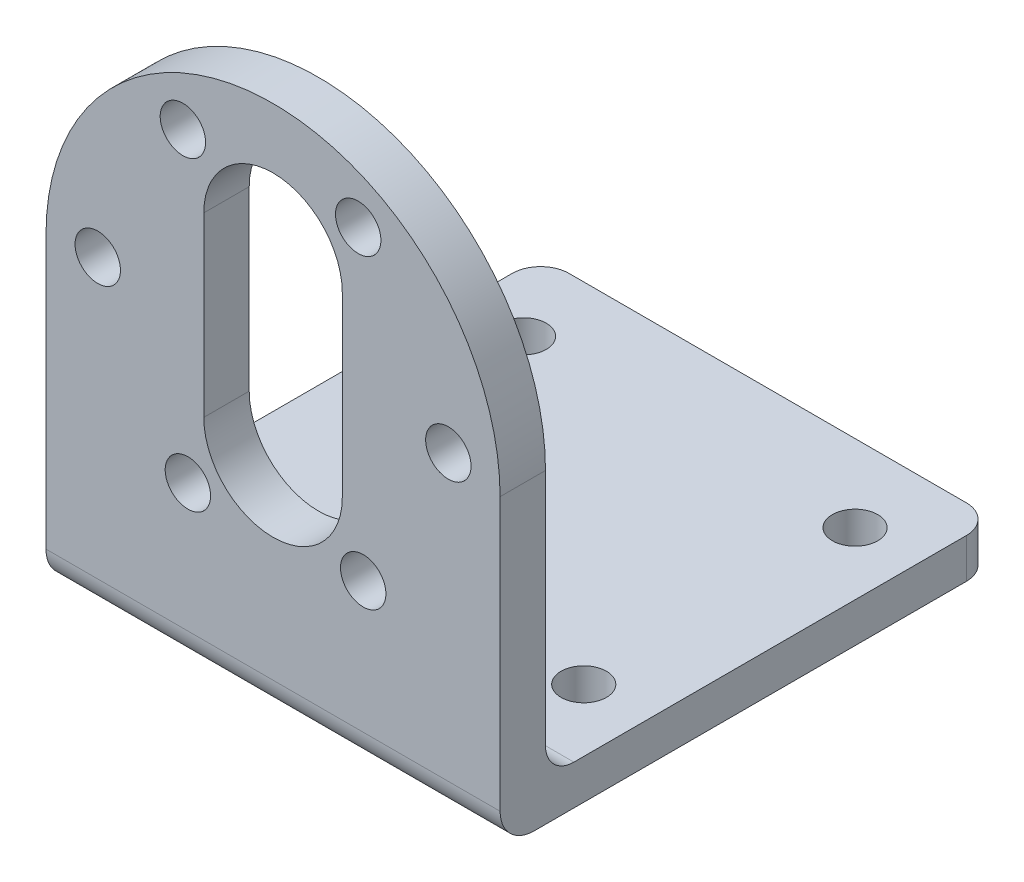
ISO-10303-21;
HEADER;
FILE_DESCRIPTION(('STEP AP214'),'2;1');
FILE_NAME('part.step','',(''),(''),'','','');
FILE_SCHEMA(('AUTOMOTIVE_DESIGN { 1 0 10303 214 1 1 1 1 }'));
ENDSEC;
DATA;
#1=APPLICATION_CONTEXT('core data for automotive mechanical design processes');
#2=APPLICATION_PROTOCOL_DEFINITION('international standard','automotive_design',2000,#1);
#3=PRODUCT_CONTEXT('',#1,'mechanical');
#4=PRODUCT('Part','Part','',(#3));
#5=PRODUCT_RELATED_PRODUCT_CATEGORY('part','',(#4));
#6=PRODUCT_DEFINITION_FORMATION('','',#4);
#7=PRODUCT_DEFINITION_CONTEXT('part definition',#1,'design');
#8=PRODUCT_DEFINITION('design','',#6,#7);
#9=PRODUCT_DEFINITION_SHAPE('','',#8);
#10=(LENGTH_UNIT() NAMED_UNIT(*) SI_UNIT(.MILLI.,.METRE.));
#11=(NAMED_UNIT(*) PLANE_ANGLE_UNIT() SI_UNIT($,.RADIAN.));
#12=(NAMED_UNIT(*) SI_UNIT($,.STERADIAN.) SOLID_ANGLE_UNIT());
#13=UNCERTAINTY_MEASURE_WITH_UNIT(LENGTH_MEASURE(1.E-05),#10,'distance_accuracy_value','');
#14=(GEOMETRIC_REPRESENTATION_CONTEXT(3) GLOBAL_UNCERTAINTY_ASSIGNED_CONTEXT((#13)) GLOBAL_UNIT_ASSIGNED_CONTEXT((#10,
#11,#12)) REPRESENTATION_CONTEXT('',''));
#15=CARTESIAN_POINT('',(0.,0.,0.));
#16=DIRECTION('',(0.,0.,1.));
#17=DIRECTION('',(1.,0.,0.));
#18=AXIS2_PLACEMENT_3D('',#15,#16,#17);
#19=CARTESIAN_POINT('',(40.,36.5355172413793,35.3894084655198));
#20=DIRECTION('',(0.,0.,-1.));
#21=DIRECTION('',(0.,1.,0.));
#22=AXIS2_PLACEMENT_3D('',#19,#20,#21);
#23=PLANE('',#22);
#24=CARTESIAN_POINT('',(4.5586570489113,23.0107077697608,35.3894084655198));
#25=DIRECTION('',(0.,0.,-1.));
#26=DIRECTION('',(0.,1.,0.));
#27=AXIS2_PLACEMENT_3D('',#24,#25,#26);
#28=CIRCLE('',#27,2.00000000000148);
#29=CARTESIAN_POINT('',(4.5586570489113,25.0107077697623,35.3894084655198));
#30=VERTEX_POINT('',#29);
#31=EDGE_CURVE('E726',#30,#30,#28,.F.);
#32=ORIENTED_EDGE('',*,*,#31,.T.);
#33=EDGE_LOOP('',(#32));
#34=FACE_BOUND('',#33,.T.);
#35=CARTESIAN_POINT('',(12.0586570489103,36.5107077697614,35.3894084655198));
#36=DIRECTION('',(0.,0.,-1.));
#37=DIRECTION('',(0.,1.,0.));
#38=AXIS2_PLACEMENT_3D('',#35,#36,#37);
#39=CIRCLE('',#38,2.00000000000082);
#40=CARTESIAN_POINT('',(12.0586570489103,38.5107077697622,35.3894084655198));
#41=VERTEX_POINT('',#40);
#42=EDGE_CURVE('E730',#41,#41,#39,.F.);
#43=ORIENTED_EDGE('',*,*,#42,.T.);
#44=EDGE_LOOP('',(#43));
#45=FACE_BOUND('',#44,.T.);
#46=CARTESIAN_POINT('',(27.5,36.7655172413793,35.3894084655198));
#47=DIRECTION('',(0.,0.,-1.));
#48=DIRECTION('',(0.,1.,0.));
#49=AXIS2_PLACEMENT_3D('',#46,#47,#48);
#50=CIRCLE('',#49,2.);
#51=CARTESIAN_POINT('',(27.5,38.7655172413793,35.3894084655198));
#52=VERTEX_POINT('',#51);
#53=EDGE_CURVE('E760',#52,#52,#50,.F.);
#54=ORIENTED_EDGE('',*,*,#53,.T.);
#55=EDGE_LOOP('',(#54));
#56=FACE_BOUND('',#55,.T.);
#57=CARTESIAN_POINT('',(35.4413429510911,23.5203267129966,35.3894084655198));
#58=DIRECTION('',(0.,0.,-1.));
#59=DIRECTION('',(0.,1.,0.));
#60=AXIS2_PLACEMENT_3D('',#57,#58,#59);
#61=CIRCLE('',#60,1.99999999999968);
#62=CARTESIAN_POINT('',(35.4413429510911,25.5203267129963,35.3894084655198));
#63=VERTEX_POINT('',#62);
#64=EDGE_CURVE('E754',#63,#63,#61,.F.);
#65=ORIENTED_EDGE('',*,*,#64,.T.);
#66=EDGE_LOOP('',(#65));
#67=FACE_BOUND('',#66,.T.);
#68=CARTESIAN_POINT('',(27.9413429510923,10.020326712996,35.3894084655198));
#69=DIRECTION('',(0.,0.,-1.));
#70=DIRECTION('',(0.,1.,0.));
#71=AXIS2_PLACEMENT_3D('',#68,#69,#70);
#72=CIRCLE('',#71,2.00000000000045);
#73=CARTESIAN_POINT('',(27.9413429510923,12.0203267129965,35.3894084655198));
#74=VERTEX_POINT('',#73);
#75=EDGE_CURVE('E739',#74,#74,#72,.F.);
#76=ORIENTED_EDGE('',*,*,#75,.T.);
#77=EDGE_LOOP('',(#76));
#78=FACE_BOUND('',#77,.T.);
#79=CARTESIAN_POINT('',(12.5000000000024,9.76551724137795,35.3894084655198));
#80=DIRECTION('',(0.,0.,-1.));
#81=DIRECTION('',(0.,1.,0.));
#82=AXIS2_PLACEMENT_3D('',#79,#80,#81);
#83=CIRCLE('',#82,2.00000000000139);
#84=CARTESIAN_POINT('',(12.5000000000024,11.7655172413793,35.3894084655198));
#85=VERTEX_POINT('',#84);
#86=EDGE_CURVE('E738',#85,#85,#83,.F.);
#87=ORIENTED_EDGE('',*,*,#86,.T.);
#88=EDGE_LOOP('',(#87));
#89=FACE_BOUND('',#88,.T.);
#90=DIRECTION('',(0.,1.,0.));
#91=VECTOR('',#90,1.);
#92=CARTESIAN_POINT('',(26.1,31.0655172413793,35.3894084655198));
#93=LINE('',#92,#91);
#94=CARTESIAN_POINT('',(26.1,15.4655172413793,35.3894084655198));
#95=VERTEX_POINT('',#94);
#96=CARTESIAN_POINT('',(26.1,31.0655172413793,35.3894084655198));
#97=VERTEX_POINT('',#96);
#98=EDGE_CURVE('E261',#95,#97,#93,.T.);
#99=ORIENTED_EDGE('',*,*,#98,.T.);
#100=CARTESIAN_POINT('',(20.,31.0655172413793,35.3894084655198));
#101=DIRECTION('',(0.,0.,-1.));
#102=DIRECTION('',(0.,1.,0.));
#103=AXIS2_PLACEMENT_3D('',#100,#101,#102);
#104=CIRCLE('',#103,6.1);
#105=CARTESIAN_POINT('',(13.9,31.0655172413793,35.3894084655198));
#106=VERTEX_POINT('',#105);
#107=EDGE_CURVE('E248',#97,#106,#104,.F.);
#108=ORIENTED_EDGE('',*,*,#107,.T.);
#109=DIRECTION('',(0.,-1.,0.));
#110=VECTOR('',#109,1.);
#111=CARTESIAN_POINT('',(13.9,15.4655172413793,35.3894084655198));
#112=LINE('',#111,#110);
#113=CARTESIAN_POINT('',(13.9,15.4655172413793,35.3894084655198));
#114=VERTEX_POINT('',#113);
#115=EDGE_CURVE('E278',#106,#114,#112,.T.);
#116=ORIENTED_EDGE('',*,*,#115,.T.);
#117=CARTESIAN_POINT('',(20.,15.4655172413793,35.3894084655198));
#118=DIRECTION('',(0.,0.,-1.));
#119=DIRECTION('',(0.,1.,0.));
#120=AXIS2_PLACEMENT_3D('',#117,#118,#119);
#121=CIRCLE('',#120,6.1);
#122=EDGE_CURVE('E268',#114,#95,#121,.F.);
#123=ORIENTED_EDGE('',*,*,#122,.T.);
#124=EDGE_LOOP('',(#99,#108,#116,#123));
#125=FACE_BOUND('',#124,.T.);
#126=DIRECTION('',(0.,-1.,0.));
#127=VECTOR('',#126,1.);
#128=CARTESIAN_POINT('',(0.,36.5355172413793,35.3894084655198));
#129=LINE('',#128,#127);
#130=CARTESIAN_POINT('',(0.,22.4655172413793,35.3894084655198));
#131=VERTEX_POINT('',#130);
#132=CARTESIAN_POINT('',(0.,1.46551724137931,35.3894084655198));
#133=VERTEX_POINT('',#132);
#134=EDGE_CURVE('E337',#131,#133,#129,.T.);
#135=ORIENTED_EDGE('',*,*,#134,.F.);
#136=CARTESIAN_POINT('',(20.,22.4655172413793,35.3894084655198));
#137=DIRECTION('',(0.,0.,-1.));
#138=DIRECTION('',(0.,1.,0.));
#139=AXIS2_PLACEMENT_3D('',#136,#137,#138);
#140=CIRCLE('',#139,20.);
#141=CARTESIAN_POINT('',(40.,22.4655172413793,35.3894084655198));
#142=VERTEX_POINT('',#141);
#143=EDGE_CURVE('E286',#142,#131,#140,.F.);
#144=ORIENTED_EDGE('',*,*,#143,.F.);
#145=DIRECTION('',(0.,-1.,0.));
#146=VECTOR('',#145,1.);
#147=CARTESIAN_POINT('',(40.,36.5355172413793,35.3894084655198));
#148=LINE('',#147,#146);
#149=CARTESIAN_POINT('',(40.,1.46551724137931,35.3894084655198));
#150=VERTEX_POINT('',#149);
#151=EDGE_CURVE('E333',#142,#150,#148,.T.);
#152=ORIENTED_EDGE('',*,*,#151,.T.);
#153=DIRECTION('',(1.,0.,0.));
#154=VECTOR('',#153,1.);
#155=CARTESIAN_POINT('',(0.,1.46551724137931,35.3894084655198));
#156=LINE('',#155,#154);
#157=EDGE_CURVE('E350',#150,#133,#156,.F.);
#158=ORIENTED_EDGE('',*,*,#157,.T.);
#159=EDGE_LOOP('',(#135,#144,#152,#158));
#160=FACE_BOUND('',#159,.T.);
#161=ADVANCED_FACE('F147',(#34,#45,#56,#67,#78,#89,#125,#160),#23,.T.);
#162=CARTESIAN_POINT('',(0.,0.,0.));
#163=DIRECTION('',(1.,0.,0.));
#164=DIRECTION('',(0.,0.,-1.));
#165=AXIS2_PLACEMENT_3D('',#162,#163,#164);
#166=PLANE('',#165);
#167=DIRECTION('',(0.,0.,-1.));
#168=VECTOR('',#167,1.);
#169=CARTESIAN_POINT('',(0.,-4.53448275862069,39.3894084655199));
#170=LINE('',#169,#168);
#171=CARTESIAN_POINT('',(0.,-4.53448275862069,36.3894084655199));
#172=VERTEX_POINT('',#171);
#173=CARTESIAN_POINT('',(0.,-4.53448275862069,-1.67959153448014));
#174=VERTEX_POINT('',#173);
#175=EDGE_CURVE('E321',#172,#174,#170,.T.);
#176=ORIENTED_EDGE('',*,*,#175,.F.);
#177=CARTESIAN_POINT('',(0.,-1.53448275862069,36.3894084655199));
#178=DIRECTION('',(1.,0.,0.));
#179=DIRECTION('',(0.,0.,-1.));
#180=AXIS2_PLACEMENT_3D('',#177,#178,#179);
#181=CIRCLE('',#180,3.);
#182=CARTESIAN_POINT('',(0.,-1.53448275862069,39.3894084655199));
#183=VERTEX_POINT('',#182);
#184=EDGE_CURVE('E378',#172,#183,#181,.F.);
#185=ORIENTED_EDGE('',*,*,#184,.T.);
#186=DIRECTION('',(0.,-1.,0.));
#187=VECTOR('',#186,1.);
#188=CARTESIAN_POINT('',(0.,16.5355172413793,39.3894084655199));
#189=LINE('',#188,#187);
#190=CARTESIAN_POINT('',(0.,22.4655172413793,39.3894084655199));
#191=VERTEX_POINT('',#190);
#192=EDGE_CURVE('E326',#191,#183,#189,.T.);
#193=ORIENTED_EDGE('',*,*,#192,.F.);
#194=DIRECTION('',(0.,0.,-1.));
#195=VECTOR('',#194,1.);
#196=CARTESIAN_POINT('',(0.,22.4655172413793,39.3894084655199));
#197=LINE('',#196,#195);
#198=EDGE_CURVE('E288',#191,#131,#197,.T.);
#199=ORIENTED_EDGE('',*,*,#198,.T.);
#200=ORIENTED_EDGE('',*,*,#134,.T.);
#201=CARTESIAN_POINT('',(0.,1.46551724137931,32.8894084655198));
#202=DIRECTION('',(1.,0.,0.));
#203=DIRECTION('',(0.,0.,-1.));
#204=AXIS2_PLACEMENT_3D('',#201,#202,#203);
#205=CIRCLE('',#204,2.5);
#206=CARTESIAN_POINT('',(0.,-1.03448275862069,32.8894084655198));
#207=VERTEX_POINT('',#206);
#208=EDGE_CURVE('E354',#133,#207,#205,.T.);
#209=ORIENTED_EDGE('',*,*,#208,.T.);
#210=DIRECTION('',(0.,0.,-1.));
#211=VECTOR('',#210,1.);
#212=CARTESIAN_POINT('',(0.,-1.03448275862069,36.8894084655199));
#213=LINE('',#212,#211);
#214=CARTESIAN_POINT('',(0.,-1.03448275862069,-1.67959153448014));
#215=VERTEX_POINT('',#214);
#216=EDGE_CURVE('E332',#207,#215,#213,.T.);
#217=ORIENTED_EDGE('',*,*,#216,.T.);
#218=DIRECTION('',(0.,1.,0.));
#219=VECTOR('',#218,1.);
#220=CARTESIAN_POINT('',(0.,0.,-1.67959153448014));
#221=LINE('',#220,#219);
#222=EDGE_CURVE('E372',#215,#174,#221,.F.);
#223=ORIENTED_EDGE('',*,*,#222,.T.);
#224=EDGE_LOOP('',(#176,#185,#193,#199,#200,#209,#217,#223));
#225=FACE_BOUND('',#224,.T.);
#226=ADVANCED_FACE('F396',(#225),#166,.F.);
#227=CARTESIAN_POINT('',(40.,0.,0.));
#228=DIRECTION('',(1.,0.,0.));
#229=DIRECTION('',(0.,0.,-1.));
#230=AXIS2_PLACEMENT_3D('',#227,#228,#229);
#231=PLANE('',#230);
#232=DIRECTION('',(0.,1.,0.));
#233=VECTOR('',#232,1.);
#234=CARTESIAN_POINT('',(40.,-2.53448275862069,39.3894084655199));
#235=LINE('',#234,#233);
#236=CARTESIAN_POINT('',(40.,-1.53448275862069,39.3894084655199));
#237=VERTEX_POINT('',#236);
#238=CARTESIAN_POINT('',(40.,22.4655172413793,39.3894084655199));
#239=VERTEX_POINT('',#238);
#240=EDGE_CURVE('E329',#237,#239,#235,.T.);
#241=ORIENTED_EDGE('',*,*,#240,.F.);
#242=CARTESIAN_POINT('',(40.,-1.53448275862069,36.3894084655199));
#243=DIRECTION('',(1.,0.,0.));
#244=DIRECTION('',(0.,0.,-1.));
#245=AXIS2_PLACEMENT_3D('',#242,#243,#244);
#246=CIRCLE('',#245,3.);
#247=CARTESIAN_POINT('',(40.,-4.53448275862069,36.3894084655199));
#248=VERTEX_POINT('',#247);
#249=EDGE_CURVE('E12',#237,#248,#246,.T.);
#250=ORIENTED_EDGE('',*,*,#249,.T.);
#251=DIRECTION('',(0.,0.,1.));
#252=VECTOR('',#251,1.);
#253=CARTESIAN_POINT('',(40.,-4.53448275862069,39.3894084655199));
#254=LINE('',#253,#252);
#255=CARTESIAN_POINT('',(40.,-4.53448275862069,-1.67959153448014));
#256=VERTEX_POINT('',#255);
#257=EDGE_CURVE('E318',#256,#248,#254,.T.);
#258=ORIENTED_EDGE('',*,*,#257,.F.);
#259=DIRECTION('',(0.,1.,0.));
#260=VECTOR('',#259,1.);
#261=CARTESIAN_POINT('',(40.,-1.03448275862069,-1.67959153448014));
#262=LINE('',#261,#260);
#263=CARTESIAN_POINT('',(40.,-1.03448275862069,-1.67959153448014));
#264=VERTEX_POINT('',#263);
#265=EDGE_CURVE('E356',#256,#264,#262,.T.);
#266=ORIENTED_EDGE('',*,*,#265,.T.);
#267=DIRECTION('',(0.,0.,-1.));
#268=VECTOR('',#267,1.);
#269=CARTESIAN_POINT('',(40.,-1.03448275862069,36.8894084655199));
#270=LINE('',#269,#268);
#271=CARTESIAN_POINT('',(40.,-1.03448275862069,32.8894084655198));
#272=VERTEX_POINT('',#271);
#273=EDGE_CURVE('E341',#272,#264,#270,.T.);
#274=ORIENTED_EDGE('',*,*,#273,.F.);
#275=CARTESIAN_POINT('',(40.,1.46551724137931,32.8894084655198));
#276=DIRECTION('',(1.,0.,0.));
#277=DIRECTION('',(0.,0.,-1.));
#278=AXIS2_PLACEMENT_3D('',#275,#276,#277);
#279=CIRCLE('',#278,2.5);
#280=EDGE_CURVE('E352',#272,#150,#279,.F.);
#281=ORIENTED_EDGE('',*,*,#280,.T.);
#282=ORIENTED_EDGE('',*,*,#151,.F.);
#283=DIRECTION('',(0.,0.,1.));
#284=VECTOR('',#283,1.);
#285=CARTESIAN_POINT('',(40.,22.4655172413793,39.3894084655199));
#286=LINE('',#285,#284);
#287=EDGE_CURVE('E291',#142,#239,#286,.T.);
#288=ORIENTED_EDGE('',*,*,#287,.T.);
#289=EDGE_LOOP('',(#241,#250,#258,#266,#274,#281,#282,#288));
#290=FACE_BOUND('',#289,.T.);
#291=ADVANCED_FACE('F387',(#290),#231,.T.);
#292=CARTESIAN_POINT('',(40.,-2.53448275862069,-4.17959153448014));
#293=DIRECTION('',(0.,0.,1.));
#294=DIRECTION('',(1.,0.,0.));
#295=AXIS2_PLACEMENT_3D('',#292,#293,#294);
#296=PLANE('',#295);
#297=DIRECTION('',(-1.,0.,0.));
#298=VECTOR('',#297,1.);
#299=CARTESIAN_POINT('',(40.,-1.03448275862069,-4.17959153448014));
#300=LINE('',#299,#298);
#301=CARTESIAN_POINT('',(37.5,-1.03448275862069,-4.17959153448014));
#302=VERTEX_POINT('',#301);
#303=CARTESIAN_POINT('',(2.5,-1.03448275862069,-4.17959153448014));
#304=VERTEX_POINT('',#303);
#305=EDGE_CURVE('E340',#302,#304,#300,.T.);
#306=ORIENTED_EDGE('',*,*,#305,.F.);
#307=DIRECTION('',(0.,1.,0.));
#308=VECTOR('',#307,1.);
#309=CARTESIAN_POINT('',(37.5,-4.53448275862069,-4.17959153448014));
#310=LINE('',#309,#308);
#311=CARTESIAN_POINT('',(37.5,-4.53448275862069,-4.17959153448014));
#312=VERTEX_POINT('',#311);
#313=EDGE_CURVE('E366',#302,#312,#310,.F.);
#314=ORIENTED_EDGE('',*,*,#313,.T.);
#315=DIRECTION('',(1.,0.,0.));
#316=VECTOR('',#315,1.);
#317=CARTESIAN_POINT('',(40.,-4.53448275862069,-4.17959153448014));
#318=LINE('',#317,#316);
#319=CARTESIAN_POINT('',(2.5,-4.53448275862069,-4.17959153448014));
#320=VERTEX_POINT('',#319);
#321=EDGE_CURVE('E323',#320,#312,#318,.T.);
#322=ORIENTED_EDGE('',*,*,#321,.F.);
#323=DIRECTION('',(0.,1.,0.));
#324=VECTOR('',#323,1.);
#325=CARTESIAN_POINT('',(2.5,-2.53448275862069,-4.17959153448014));
#326=LINE('',#325,#324);
#327=EDGE_CURVE('E363',#320,#304,#326,.T.);
#328=ORIENTED_EDGE('',*,*,#327,.T.);
#329=EDGE_LOOP('',(#306,#314,#322,#328));
#330=FACE_BOUND('',#329,.T.);
#331=ADVANCED_FACE('F407',(#330),#296,.F.);
#332=CARTESIAN_POINT('',(40.,-1.03448275862069,36.8894084655199));
#333=DIRECTION('',(0.,1.,0.));
#334=DIRECTION('',(0.,0.,1.));
#335=AXIS2_PLACEMENT_3D('',#332,#333,#334);
#336=PLANE('',#335);
#337=CARTESIAN_POINT('',(34.5,-1.03448275862069,26.5204084655199));
#338=DIRECTION('',(0.,1.,0.));
#339=DIRECTION('',(0.,0.,1.));
#340=AXIS2_PLACEMENT_3D('',#337,#338,#339);
#341=CIRCLE('',#340,2.);
#342=CARTESIAN_POINT('',(34.5,-1.03448275862069,28.5204084655199));
#343=VERTEX_POINT('',#342);
#344=EDGE_CURVE('E301',#343,#343,#341,.T.);
#345=ORIENTED_EDGE('',*,*,#344,.F.);
#346=EDGE_LOOP('',(#345));
#347=FACE_BOUND('',#346,.T.);
#348=CARTESIAN_POINT('',(5.3,-1.03448275862069,2.62040846551986));
#349=DIRECTION('',(0.,1.,0.));
#350=DIRECTION('',(0.,0.,1.));
#351=AXIS2_PLACEMENT_3D('',#348,#349,#350);
#352=CIRCLE('',#351,2.);
#353=CARTESIAN_POINT('',(5.3,-1.03448275862069,4.62040846551986));
#354=VERTEX_POINT('',#353);
#355=EDGE_CURVE('E300',#354,#354,#352,.T.);
#356=ORIENTED_EDGE('',*,*,#355,.F.);
#357=EDGE_LOOP('',(#356));
#358=FACE_BOUND('',#357,.T.);
#359=CARTESIAN_POINT('',(5.3,-1.03448275862069,26.5204084655199));
#360=DIRECTION('',(0.,1.,0.));
#361=DIRECTION('',(0.,0.,1.));
#362=AXIS2_PLACEMENT_3D('',#359,#360,#361);
#363=CIRCLE('',#362,2.);
#364=CARTESIAN_POINT('',(5.3,-1.03448275862069,28.5204084655199));
#365=VERTEX_POINT('',#364);
#366=EDGE_CURVE('E294',#365,#365,#363,.T.);
#367=ORIENTED_EDGE('',*,*,#366,.F.);
#368=EDGE_LOOP('',(#367));
#369=FACE_BOUND('',#368,.T.);
#370=CARTESIAN_POINT('',(34.5,-1.03448275862069,2.62040846551986));
#371=DIRECTION('',(0.,1.,0.));
#372=DIRECTION('',(0.,0.,1.));
#373=AXIS2_PLACEMENT_3D('',#370,#371,#372);
#374=CIRCLE('',#373,2.);
#375=CARTESIAN_POINT('',(34.5,-1.03448275862069,4.62040846551986));
#376=VERTEX_POINT('',#375);
#377=EDGE_CURVE('E308',#376,#376,#374,.T.);
#378=ORIENTED_EDGE('',*,*,#377,.F.);
#379=EDGE_LOOP('',(#378));
#380=FACE_BOUND('',#379,.T.);
#381=ORIENTED_EDGE('',*,*,#273,.T.);
#382=CARTESIAN_POINT('',(37.5,-1.03448275862069,-1.67959153448014));
#383=DIRECTION('',(0.,1.,0.));
#384=DIRECTION('',(0.,0.,1.));
#385=AXIS2_PLACEMENT_3D('',#382,#383,#384);
#386=CIRCLE('',#385,2.5);
#387=EDGE_CURVE('E361',#264,#302,#386,.T.);
#388=ORIENTED_EDGE('',*,*,#387,.T.);
#389=ORIENTED_EDGE('',*,*,#305,.T.);
#390=CARTESIAN_POINT('',(2.5,-1.03448275862069,-1.67959153448014));
#391=DIRECTION('',(0.,1.,0.));
#392=DIRECTION('',(0.,0.,1.));
#393=AXIS2_PLACEMENT_3D('',#390,#391,#392);
#394=CIRCLE('',#393,2.5);
#395=EDGE_CURVE('E359',#304,#215,#394,.T.);
#396=ORIENTED_EDGE('',*,*,#395,.T.);
#397=ORIENTED_EDGE('',*,*,#216,.F.);
#398=DIRECTION('',(1.,0.,0.));
#399=VECTOR('',#398,1.);
#400=CARTESIAN_POINT('',(40.,-1.03448275862069,32.8894084655198));
#401=LINE('',#400,#399);
#402=EDGE_CURVE('E336',#207,#272,#401,.T.);
#403=ORIENTED_EDGE('',*,*,#402,.T.);
#404=EDGE_LOOP('',(#381,#388,#389,#396,#397,#403));
#405=FACE_BOUND('',#404,.T.);
#406=ADVANCED_FACE('F414',(#347,#358,#369,#380,#405),#336,.T.);
#407=CARTESIAN_POINT('',(20.,16.5355172413793,39.3894084655199));
#408=DIRECTION('',(0.,0.,1.));
#409=DIRECTION('',(1.,0.,0.));
#410=AXIS2_PLACEMENT_3D('',#407,#408,#409);
#411=PLANE('',#410);
#412=CARTESIAN_POINT('',(4.5586570489113,23.0107077697608,39.3894084655199));
#413=DIRECTION('',(0.,0.,1.));
#414=DIRECTION('',(1.,0.,0.));
#415=AXIS2_PLACEMENT_3D('',#412,#413,#414);
#416=CIRCLE('',#415,2.00000000000148);
#417=CARTESIAN_POINT('',(6.55865704891278,23.0107077697608,39.3894084655199));
#418=VERTEX_POINT('',#417);
#419=EDGE_CURVE('E724',#418,#418,#416,.T.);
#420=ORIENTED_EDGE('',*,*,#419,.F.);
#421=EDGE_LOOP('',(#420));
#422=FACE_BOUND('',#421,.T.);
#423=CARTESIAN_POINT('',(12.0586570489103,36.5107077697614,39.3894084655199));
#424=DIRECTION('',(0.,0.,1.));
#425=DIRECTION('',(1.,0.,0.));
#426=AXIS2_PLACEMENT_3D('',#423,#424,#425);
#427=CIRCLE('',#426,2.00000000000082);
#428=CARTESIAN_POINT('',(14.0586570489111,36.5107077697614,39.3894084655199));
#429=VERTEX_POINT('',#428);
#430=EDGE_CURVE('E727',#429,#429,#427,.T.);
#431=ORIENTED_EDGE('',*,*,#430,.F.);
#432=EDGE_LOOP('',(#431));
#433=FACE_BOUND('',#432,.T.);
#434=CARTESIAN_POINT('',(27.5,36.7655172413793,39.3894084655199));
#435=DIRECTION('',(0.,0.,1.));
#436=DIRECTION('',(1.,0.,0.));
#437=AXIS2_PLACEMENT_3D('',#434,#435,#436);
#438=CIRCLE('',#437,2.);
#439=CARTESIAN_POINT('',(29.5,36.7655172413793,39.3894084655199));
#440=VERTEX_POINT('',#439);
#441=EDGE_CURVE('E763',#440,#440,#438,.T.);
#442=ORIENTED_EDGE('',*,*,#441,.F.);
#443=EDGE_LOOP('',(#442));
#444=FACE_BOUND('',#443,.T.);
#445=CARTESIAN_POINT('',(35.4413429510911,23.5203267129966,39.3894084655199));
#446=DIRECTION('',(0.,0.,1.));
#447=DIRECTION('',(1.,0.,0.));
#448=AXIS2_PLACEMENT_3D('',#445,#446,#447);
#449=CIRCLE('',#448,1.99999999999968);
#450=CARTESIAN_POINT('',(37.4413429510908,23.5203267129966,39.3894084655199));
#451=VERTEX_POINT('',#450);
#452=EDGE_CURVE('E757',#451,#451,#449,.T.);
#453=ORIENTED_EDGE('',*,*,#452,.F.);
#454=EDGE_LOOP('',(#453));
#455=FACE_BOUND('',#454,.T.);
#456=CARTESIAN_POINT('',(27.9413429510923,10.020326712996,39.3894084655199));
#457=DIRECTION('',(0.,0.,1.));
#458=DIRECTION('',(1.,0.,0.));
#459=AXIS2_PLACEMENT_3D('',#456,#457,#458);
#460=CIRCLE('',#459,2.00000000000045);
#461=CARTESIAN_POINT('',(29.9413429510928,10.020326712996,39.3894084655199));
#462=VERTEX_POINT('',#461);
#463=EDGE_CURVE('E749',#462,#462,#460,.T.);
#464=ORIENTED_EDGE('',*,*,#463,.F.);
#465=EDGE_LOOP('',(#464));
#466=FACE_BOUND('',#465,.T.);
#467=CARTESIAN_POINT('',(12.5000000000024,9.76551724137795,39.3894084655199));
#468=DIRECTION('',(0.,0.,1.));
#469=DIRECTION('',(1.,0.,0.));
#470=AXIS2_PLACEMENT_3D('',#467,#468,#469);
#471=CIRCLE('',#470,2.00000000000139);
#472=CARTESIAN_POINT('',(14.5000000000038,9.76551724137795,39.3894084655199));
#473=VERTEX_POINT('',#472);
#474=EDGE_CURVE('E735',#473,#473,#471,.T.);
#475=ORIENTED_EDGE('',*,*,#474,.F.);
#476=EDGE_LOOP('',(#475));
#477=FACE_BOUND('',#476,.T.);
#478=DIRECTION('',(0.,1.,0.));
#479=VECTOR('',#478,1.);
#480=CARTESIAN_POINT('',(26.1,31.0655172413793,39.3894084655199));
#481=LINE('',#480,#479);
#482=CARTESIAN_POINT('',(26.1,15.4655172413793,39.3894084655199));
#483=VERTEX_POINT('',#482);
#484=CARTESIAN_POINT('',(26.1,31.0655172413793,39.3894084655199));
#485=VERTEX_POINT('',#484);
#486=EDGE_CURVE('E264',#483,#485,#481,.T.);
#487=ORIENTED_EDGE('',*,*,#486,.F.);
#488=CARTESIAN_POINT('',(20.,15.4655172413793,39.3894084655199));
#489=DIRECTION('',(0.,0.,1.));
#490=DIRECTION('',(1.,0.,0.));
#491=AXIS2_PLACEMENT_3D('',#488,#489,#490);
#492=CIRCLE('',#491,6.1);
#493=CARTESIAN_POINT('',(13.9,15.4655172413793,39.3894084655199));
#494=VERTEX_POINT('',#493);
#495=EDGE_CURVE('E274',#494,#483,#492,.T.);
#496=ORIENTED_EDGE('',*,*,#495,.F.);
#497=DIRECTION('',(0.,-1.,0.));
#498=VECTOR('',#497,1.);
#499=CARTESIAN_POINT('',(13.9,15.4655172413793,39.3894084655199));
#500=LINE('',#499,#498);
#501=CARTESIAN_POINT('',(13.9,31.0655172413793,39.3894084655199));
#502=VERTEX_POINT('',#501);
#503=EDGE_CURVE('E170',#502,#494,#500,.T.);
#504=ORIENTED_EDGE('',*,*,#503,.F.);
#505=CARTESIAN_POINT('',(20.,31.0655172413793,39.3894084655199));
#506=DIRECTION('',(0.,0.,1.));
#507=DIRECTION('',(-1.,0.,0.));
#508=AXIS2_PLACEMENT_3D('',#505,#506,#507);
#509=CIRCLE('',#508,6.1);
#510=EDGE_CURVE('E270',#485,#502,#509,.T.);
#511=ORIENTED_EDGE('',*,*,#510,.F.);
#512=EDGE_LOOP('',(#487,#496,#504,#511));
#513=FACE_BOUND('',#512,.T.);
#514=CARTESIAN_POINT('',(20.,22.4655172413793,39.3894084655199));
#515=DIRECTION('',(0.,0.,1.));
#516=DIRECTION('',(1.,0.,0.));
#517=AXIS2_PLACEMENT_3D('',#514,#515,#516);
#518=CIRCLE('',#517,20.);
#519=EDGE_CURVE('E283',#239,#191,#518,.T.);
#520=ORIENTED_EDGE('',*,*,#519,.T.);
#521=ORIENTED_EDGE('',*,*,#192,.T.);
#522=DIRECTION('',(-1.,0.,0.));
#523=VECTOR('',#522,1.);
#524=CARTESIAN_POINT('',(40.,-1.53448275862069,39.3894084655199));
#525=LINE('',#524,#523);
#526=EDGE_CURVE('E155',#183,#237,#525,.F.);
#527=ORIENTED_EDGE('',*,*,#526,.T.);
#528=ORIENTED_EDGE('',*,*,#240,.T.);
#529=EDGE_LOOP('',(#520,#521,#527,#528));
#530=FACE_BOUND('',#529,.T.);
#531=ADVANCED_FACE('F382',(#422,#433,#444,#455,#466,#477,#513,#530),#411,.T.);
#532=CARTESIAN_POINT('',(40.,1.46551724137931,32.8894084655198));
#533=DIRECTION('',(-1.,0.,0.));
#534=DIRECTION('',(0.,0.,1.));
#535=AXIS2_PLACEMENT_3D('',#532,#533,#534);
#536=CYLINDRICAL_SURFACE('',#535,2.5);
#537=ORIENTED_EDGE('',*,*,#208,.F.);
#538=ORIENTED_EDGE('',*,*,#157,.F.);
#539=ORIENTED_EDGE('',*,*,#280,.F.);
#540=ORIENTED_EDGE('',*,*,#402,.F.);
#541=EDGE_LOOP('',(#537,#538,#539,#540));
#542=FACE_BOUND('',#541,.T.);
#543=ADVANCED_FACE('F418',(#542),#536,.F.);
#544=CARTESIAN_POINT('',(0.,-4.53448275862069,0.));
#545=DIRECTION('',(0.,1.,0.));
#546=DIRECTION('',(0.,0.,1.));
#547=AXIS2_PLACEMENT_3D('',#544,#545,#546);
#548=PLANE('',#547);
#549=CARTESIAN_POINT('',(34.5,-4.53448275862069,26.5204084655199));
#550=DIRECTION('',(0.,1.,0.));
#551=DIRECTION('',(0.,0.,1.));
#552=AXIS2_PLACEMENT_3D('',#549,#550,#551);
#553=CIRCLE('',#552,2.);
#554=CARTESIAN_POINT('',(34.5,-4.53448275862069,28.5204084655199));
#555=VERTEX_POINT('',#554);
#556=EDGE_CURVE('E304',#555,#555,#553,.F.);
#557=ORIENTED_EDGE('',*,*,#556,.F.);
#558=EDGE_LOOP('',(#557));
#559=FACE_BOUND('',#558,.T.);
#560=CARTESIAN_POINT('',(5.3,-4.53448275862069,2.62040846551986));
#561=DIRECTION('',(0.,1.,0.));
#562=DIRECTION('',(0.,0.,1.));
#563=AXIS2_PLACEMENT_3D('',#560,#561,#562);
#564=CIRCLE('',#563,2.);
#565=CARTESIAN_POINT('',(5.3,-4.53448275862069,4.62040846551986));
#566=VERTEX_POINT('',#565);
#567=EDGE_CURVE('E305',#566,#566,#564,.F.);
#568=ORIENTED_EDGE('',*,*,#567,.F.);
#569=EDGE_LOOP('',(#568));
#570=FACE_BOUND('',#569,.T.);
#571=CARTESIAN_POINT('',(5.3,-4.53448275862069,26.5204084655199));
#572=DIRECTION('',(0.,1.,0.));
#573=DIRECTION('',(0.,0.,1.));
#574=AXIS2_PLACEMENT_3D('',#571,#572,#573);
#575=CIRCLE('',#574,2.);
#576=CARTESIAN_POINT('',(5.3,-4.53448275862069,28.5204084655199));
#577=VERTEX_POINT('',#576);
#578=EDGE_CURVE('E297',#577,#577,#575,.F.);
#579=ORIENTED_EDGE('',*,*,#578,.F.);
#580=EDGE_LOOP('',(#579));
#581=FACE_BOUND('',#580,.T.);
#582=CARTESIAN_POINT('',(34.5,-4.53448275862069,2.62040846551986));
#583=DIRECTION('',(0.,1.,0.));
#584=DIRECTION('',(0.,0.,1.));
#585=AXIS2_PLACEMENT_3D('',#582,#583,#584);
#586=CIRCLE('',#585,2.);
#587=CARTESIAN_POINT('',(34.5,-4.53448275862069,4.62040846551986));
#588=VERTEX_POINT('',#587);
#589=EDGE_CURVE('E315',#588,#588,#586,.F.);
#590=ORIENTED_EDGE('',*,*,#589,.F.);
#591=EDGE_LOOP('',(#590));
#592=FACE_BOUND('',#591,.T.);
#593=ORIENTED_EDGE('',*,*,#257,.T.);
#594=DIRECTION('',(-1.,0.,0.));
#595=VECTOR('',#594,1.);
#596=CARTESIAN_POINT('',(0.,-4.53448275862069,36.3894084655199));
#597=LINE('',#596,#595);
#598=EDGE_CURVE('E375',#248,#172,#597,.T.);
#599=ORIENTED_EDGE('',*,*,#598,.T.);
#600=ORIENTED_EDGE('',*,*,#175,.T.);
#601=CARTESIAN_POINT('',(2.5,-4.53448275862069,-1.67959153448014));
#602=DIRECTION('',(0.,1.,0.));
#603=DIRECTION('',(0.,0.,1.));
#604=AXIS2_PLACEMENT_3D('',#601,#602,#603);
#605=CIRCLE('',#604,2.5);
#606=EDGE_CURVE('E368',#174,#320,#605,.F.);
#607=ORIENTED_EDGE('',*,*,#606,.T.);
#608=ORIENTED_EDGE('',*,*,#321,.T.);
#609=CARTESIAN_POINT('',(37.5,-4.53448275862069,-1.67959153448014));
#610=DIRECTION('',(0.,1.,0.));
#611=DIRECTION('',(0.,0.,1.));
#612=AXIS2_PLACEMENT_3D('',#609,#610,#611);
#613=CIRCLE('',#612,2.5);
#614=EDGE_CURVE('E370',#312,#256,#613,.F.);
#615=ORIENTED_EDGE('',*,*,#614,.T.);
#616=EDGE_LOOP('',(#593,#599,#600,#607,#608,#615));
#617=FACE_BOUND('',#616,.T.);
#618=ADVANCED_FACE('F394',(#559,#570,#581,#592,#617),#548,.F.);
#619=CARTESIAN_POINT('',(37.5,0.,-1.67959153448014));
#620=DIRECTION('',(0.,-1.,0.));
#621=DIRECTION('',(0.,0.,-1.));
#622=AXIS2_PLACEMENT_3D('',#619,#620,#621);
#623=CYLINDRICAL_SURFACE('',#622,2.5);
#624=ORIENTED_EDGE('',*,*,#614,.F.);
#625=ORIENTED_EDGE('',*,*,#313,.F.);
#626=ORIENTED_EDGE('',*,*,#387,.F.);
#627=ORIENTED_EDGE('',*,*,#265,.F.);
#628=EDGE_LOOP('',(#624,#625,#626,#627));
#629=FACE_BOUND('',#628,.T.);
#630=ADVANCED_FACE('F410',(#629),#623,.T.);
#631=CARTESIAN_POINT('',(2.5,-2.53448275862069,-1.67959153448014));
#632=DIRECTION('',(0.,1.,0.));
#633=DIRECTION('',(0.,0.,1.));
#634=AXIS2_PLACEMENT_3D('',#631,#632,#633);
#635=CYLINDRICAL_SURFACE('',#634,2.5);
#636=ORIENTED_EDGE('',*,*,#606,.F.);
#637=ORIENTED_EDGE('',*,*,#222,.F.);
#638=ORIENTED_EDGE('',*,*,#395,.F.);
#639=ORIENTED_EDGE('',*,*,#327,.F.);
#640=EDGE_LOOP('',(#636,#637,#638,#639));
#641=FACE_BOUND('',#640,.T.);
#642=ADVANCED_FACE('F402',(#641),#635,.T.);
#643=CARTESIAN_POINT('',(34.5,-10.1913370081131,2.62040846551986));
#644=DIRECTION('',(0.,1.,0.));
#645=DIRECTION('',(0.,0.,1.));
#646=AXIS2_PLACEMENT_3D('',#643,#644,#645);
#647=CYLINDRICAL_SURFACE('',#646,2.);
#648=ORIENTED_EDGE('',*,*,#589,.T.);
#649=EDGE_LOOP('',(#648));
#650=FACE_BOUND('',#649,.T.);
#651=ORIENTED_EDGE('',*,*,#377,.T.);
#652=EDGE_LOOP('',(#651));
#653=FACE_BOUND('',#652,.T.);
#654=ADVANCED_FACE('F452',(#650,#653),#647,.F.);
#655=CARTESIAN_POINT('',(5.3,-10.1913370081131,26.5204084655199));
#656=DIRECTION('',(0.,1.,0.));
#657=DIRECTION('',(0.,0.,1.));
#658=AXIS2_PLACEMENT_3D('',#655,#656,#657);
#659=CYLINDRICAL_SURFACE('',#658,2.);
#660=ORIENTED_EDGE('',*,*,#578,.T.);
#661=EDGE_LOOP('',(#660));
#662=FACE_BOUND('',#661,.T.);
#663=ORIENTED_EDGE('',*,*,#366,.T.);
#664=EDGE_LOOP('',(#663));
#665=FACE_BOUND('',#664,.T.);
#666=ADVANCED_FACE('F456',(#662,#665),#659,.F.);
#667=CARTESIAN_POINT('',(5.3,-10.1913370081131,2.62040846551986));
#668=DIRECTION('',(0.,1.,0.));
#669=DIRECTION('',(0.,0.,1.));
#670=AXIS2_PLACEMENT_3D('',#667,#668,#669);
#671=CYLINDRICAL_SURFACE('',#670,2.);
#672=ORIENTED_EDGE('',*,*,#567,.T.);
#673=EDGE_LOOP('',(#672));
#674=FACE_BOUND('',#673,.T.);
#675=ORIENTED_EDGE('',*,*,#355,.T.);
#676=EDGE_LOOP('',(#675));
#677=FACE_BOUND('',#676,.T.);
#678=ADVANCED_FACE('F462',(#674,#677),#671,.F.);
#679=CARTESIAN_POINT('',(34.5,-10.1913370081131,26.5204084655199));
#680=DIRECTION('',(0.,1.,0.));
#681=DIRECTION('',(0.,0.,1.));
#682=AXIS2_PLACEMENT_3D('',#679,#680,#681);
#683=CYLINDRICAL_SURFACE('',#682,2.);
#684=ORIENTED_EDGE('',*,*,#556,.T.);
#685=EDGE_LOOP('',(#684));
#686=FACE_BOUND('',#685,.T.);
#687=ORIENTED_EDGE('',*,*,#344,.T.);
#688=EDGE_LOOP('',(#687));
#689=FACE_BOUND('',#688,.T.);
#690=ADVANCED_FACE('F430',(#686,#689),#683,.F.);
#691=CARTESIAN_POINT('',(0.,-1.53448275862069,36.3894084655199));
#692=DIRECTION('',(1.,0.,0.));
#693=DIRECTION('',(0.,0.,-1.));
#694=AXIS2_PLACEMENT_3D('',#691,#692,#693);
#695=CYLINDRICAL_SURFACE('',#694,3.);
#696=ORIENTED_EDGE('',*,*,#249,.F.);
#697=ORIENTED_EDGE('',*,*,#526,.F.);
#698=ORIENTED_EDGE('',*,*,#184,.F.);
#699=ORIENTED_EDGE('',*,*,#598,.F.);
#700=EDGE_LOOP('',(#696,#697,#698,#699));
#701=FACE_BOUND('',#700,.T.);
#702=ADVANCED_FACE('F149',(#701),#695,.T.);
#703=CARTESIAN_POINT('',(20.,22.4655172413793,-9.33195108447594));
#704=DIRECTION('',(0.,0.,1.));
#705=DIRECTION('',(1.,0.,0.));
#706=AXIS2_PLACEMENT_3D('',#703,#704,#705);
#707=CYLINDRICAL_SURFACE('',#706,20.);
#708=ORIENTED_EDGE('',*,*,#287,.F.);
#709=ORIENTED_EDGE('',*,*,#143,.T.);
#710=ORIENTED_EDGE('',*,*,#198,.F.);
#711=ORIENTED_EDGE('',*,*,#519,.F.);
#712=EDGE_LOOP('',(#708,#709,#710,#711));
#713=FACE_BOUND('',#712,.T.);
#714=ADVANCED_FACE('F422',(#713),#707,.T.);
#715=CARTESIAN_POINT('',(26.1,31.0655172413793,5.03022534080453));
#716=DIRECTION('',(1.,0.,0.));
#717=DIRECTION('',(0.,1.,0.));
#718=AXIS2_PLACEMENT_3D('',#715,#716,#717);
#719=PLANE('',#718);
#720=DIRECTION('',(0.,0.,1.));
#721=VECTOR('',#720,1.);
#722=CARTESIAN_POINT('',(26.1,15.4655172413793,5.03022534080453));
#723=LINE('',#722,#721);
#724=EDGE_CURVE('E162',#95,#483,#723,.T.);
#725=ORIENTED_EDGE('',*,*,#724,.T.);
#726=ORIENTED_EDGE('',*,*,#486,.T.);
#727=DIRECTION('',(0.,0.,1.));
#728=VECTOR('',#727,1.);
#729=CARTESIAN_POINT('',(26.1,31.0655172413793,5.03022534080453));
#730=LINE('',#729,#728);
#731=EDGE_CURVE('E252',#97,#485,#730,.T.);
#732=ORIENTED_EDGE('',*,*,#731,.F.);
#733=ORIENTED_EDGE('',*,*,#98,.F.);
#734=EDGE_LOOP('',(#725,#726,#732,#733));
#735=FACE_BOUND('',#734,.T.);
#736=ADVANCED_FACE('F260',(#735),#719,.F.);
#737=CARTESIAN_POINT('',(20.,31.0655172413793,5.03022534080453));
#738=DIRECTION('',(0.,0.,1.));
#739=DIRECTION('',(1.,0.,0.));
#740=AXIS2_PLACEMENT_3D('',#737,#738,#739);
#741=CYLINDRICAL_SURFACE('',#740,6.1);
#742=ORIENTED_EDGE('',*,*,#731,.T.);
#743=ORIENTED_EDGE('',*,*,#510,.T.);
#744=DIRECTION('',(0.,0.,1.));
#745=VECTOR('',#744,1.);
#746=CARTESIAN_POINT('',(13.9,31.0655172413793,5.03022534080453));
#747=LINE('',#746,#745);
#748=EDGE_CURVE('E254',#106,#502,#747,.T.);
#749=ORIENTED_EDGE('',*,*,#748,.F.);
#750=ORIENTED_EDGE('',*,*,#107,.F.);
#751=EDGE_LOOP('',(#742,#743,#749,#750));
#752=FACE_BOUND('',#751,.T.);
#753=ADVANCED_FACE('F250',(#752),#741,.F.);
#754=CARTESIAN_POINT('',(13.9,15.4655172413793,5.03022534080453));
#755=DIRECTION('',(-1.,0.,0.));
#756=DIRECTION('',(0.,-1.,0.));
#757=AXIS2_PLACEMENT_3D('',#754,#755,#756);
#758=PLANE('',#757);
#759=ORIENTED_EDGE('',*,*,#748,.T.);
#760=ORIENTED_EDGE('',*,*,#503,.T.);
#761=DIRECTION('',(0.,0.,1.));
#762=VECTOR('',#761,1.);
#763=CARTESIAN_POINT('',(13.9,15.4655172413793,5.03022534080453));
#764=LINE('',#763,#762);
#765=EDGE_CURVE('E277',#114,#494,#764,.T.);
#766=ORIENTED_EDGE('',*,*,#765,.F.);
#767=ORIENTED_EDGE('',*,*,#115,.F.);
#768=EDGE_LOOP('',(#759,#760,#766,#767));
#769=FACE_BOUND('',#768,.T.);
#770=ADVANCED_FACE('F641',(#769),#758,.F.);
#771=CARTESIAN_POINT('',(20.,15.4655172413793,5.03022534080453));
#772=DIRECTION('',(0.,0.,1.));
#773=DIRECTION('',(1.,0.,0.));
#774=AXIS2_PLACEMENT_3D('',#771,#772,#773);
#775=CYLINDRICAL_SURFACE('',#774,6.1);
#776=ORIENTED_EDGE('',*,*,#765,.T.);
#777=ORIENTED_EDGE('',*,*,#495,.T.);
#778=ORIENTED_EDGE('',*,*,#724,.F.);
#779=ORIENTED_EDGE('',*,*,#122,.F.);
#780=EDGE_LOOP('',(#776,#777,#778,#779));
#781=FACE_BOUND('',#780,.T.);
#782=ADVANCED_FACE('F649',(#781),#775,.F.);
#783=CARTESIAN_POINT('',(12.5000000000024,9.76551724137795,29.7325542160233));
#784=DIRECTION('',(0.,0.,1.));
#785=DIRECTION('',(1.,0.,0.));
#786=AXIS2_PLACEMENT_3D('',#783,#784,#785);
#787=CYLINDRICAL_SURFACE('',#786,2.00000000000139);
#788=ORIENTED_EDGE('',*,*,#474,.T.);
#789=EDGE_LOOP('',(#788));
#790=FACE_BOUND('',#789,.T.);
#791=ORIENTED_EDGE('',*,*,#86,.F.);
#792=EDGE_LOOP('',(#791));
#793=FACE_BOUND('',#792,.T.);
#794=ADVANCED_FACE('F657',(#790,#793),#787,.F.);
#795=CARTESIAN_POINT('',(27.9413429510923,10.020326712996,29.7325542160233));
#796=DIRECTION('',(0.,0.,1.));
#797=DIRECTION('',(1.,0.,0.));
#798=AXIS2_PLACEMENT_3D('',#795,#796,#797);
#799=CYLINDRICAL_SURFACE('',#798,2.00000000000045);
#800=ORIENTED_EDGE('',*,*,#463,.T.);
#801=EDGE_LOOP('',(#800));
#802=FACE_BOUND('',#801,.T.);
#803=ORIENTED_EDGE('',*,*,#75,.F.);
#804=EDGE_LOOP('',(#803));
#805=FACE_BOUND('',#804,.T.);
#806=ADVANCED_FACE('F664',(#802,#805),#799,.F.);
#807=CARTESIAN_POINT('',(35.4413429510911,23.5203267129966,29.7325542160233));
#808=DIRECTION('',(0.,0.,1.));
#809=DIRECTION('',(1.,0.,0.));
#810=AXIS2_PLACEMENT_3D('',#807,#808,#809);
#811=CYLINDRICAL_SURFACE('',#810,1.99999999999968);
#812=ORIENTED_EDGE('',*,*,#452,.T.);
#813=EDGE_LOOP('',(#812));
#814=FACE_BOUND('',#813,.T.);
#815=ORIENTED_EDGE('',*,*,#64,.F.);
#816=EDGE_LOOP('',(#815));
#817=FACE_BOUND('',#816,.T.);
#818=ADVANCED_FACE('F673',(#814,#817),#811,.F.);
#819=CARTESIAN_POINT('',(27.5,36.7655172413793,29.7325542160233));
#820=DIRECTION('',(0.,0.,1.));
#821=DIRECTION('',(1.,0.,0.));
#822=AXIS2_PLACEMENT_3D('',#819,#820,#821);
#823=CYLINDRICAL_SURFACE('',#822,2.);
#824=ORIENTED_EDGE('',*,*,#441,.T.);
#825=EDGE_LOOP('',(#824));
#826=FACE_BOUND('',#825,.T.);
#827=ORIENTED_EDGE('',*,*,#53,.F.);
#828=EDGE_LOOP('',(#827));
#829=FACE_BOUND('',#828,.T.);
#830=ADVANCED_FACE('F682',(#826,#829),#823,.F.);
#831=CARTESIAN_POINT('',(12.0586570489103,36.5107077697614,29.7325542160233));
#832=DIRECTION('',(0.,0.,1.));
#833=DIRECTION('',(1.,0.,0.));
#834=AXIS2_PLACEMENT_3D('',#831,#832,#833);
#835=CYLINDRICAL_SURFACE('',#834,2.00000000000082);
#836=ORIENTED_EDGE('',*,*,#430,.T.);
#837=EDGE_LOOP('',(#836));
#838=FACE_BOUND('',#837,.T.);
#839=ORIENTED_EDGE('',*,*,#42,.F.);
#840=EDGE_LOOP('',(#839));
#841=FACE_BOUND('',#840,.T.);
#842=ADVANCED_FACE('F691',(#838,#841),#835,.F.);
#843=CARTESIAN_POINT('',(4.5586570489113,23.0107077697608,29.7325542160233));
#844=DIRECTION('',(0.,0.,1.));
#845=DIRECTION('',(1.,0.,0.));
#846=AXIS2_PLACEMENT_3D('',#843,#844,#845);
#847=CYLINDRICAL_SURFACE('',#846,2.00000000000148);
#848=ORIENTED_EDGE('',*,*,#419,.T.);
#849=EDGE_LOOP('',(#848));
#850=FACE_BOUND('',#849,.T.);
#851=ORIENTED_EDGE('',*,*,#31,.F.);
#852=EDGE_LOOP('',(#851));
#853=FACE_BOUND('',#852,.T.);
#854=ADVANCED_FACE('F700',(#850,#853),#847,.F.);
#855=CLOSED_SHELL('',(#161,#226,#291,#331,#406,#531,#543,#618,#630,#642,#654,#666,#678,#690,
#702,#714,#736,#753,#770,#782,#794,#806,#818,#830,#842,#854));
#856=MANIFOLD_SOLID_BREP('B2',#855);
#857=ADVANCED_BREP_SHAPE_REPRESENTATION('',(#18,#856),#14);
#858=SHAPE_DEFINITION_REPRESENTATION(#9,#857);
ENDSEC;
END-ISO-10303-21;
